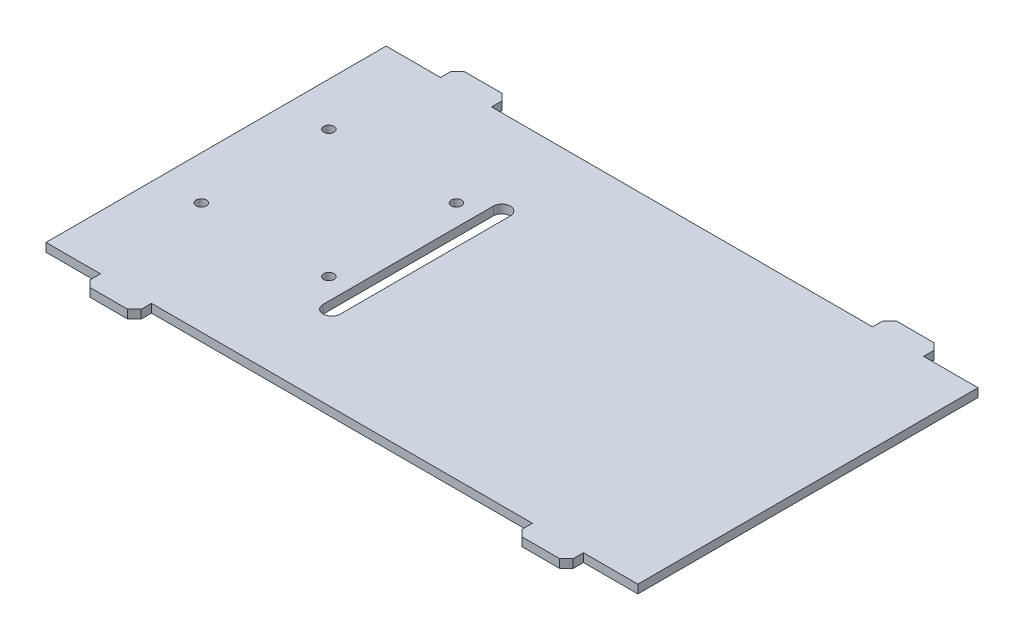
ISO-10303-21;
HEADER;
FILE_DESCRIPTION(('STEP AP214'),'2;1');
FILE_NAME('part.step','',(''),(''),'','','');
FILE_SCHEMA(('AUTOMOTIVE_DESIGN { 1 0 10303 214 1 1 1 1 }'));
ENDSEC;
DATA;
#1=APPLICATION_CONTEXT('core data for automotive mechanical design processes');
#2=APPLICATION_PROTOCOL_DEFINITION('international standard','automotive_design',2000,#1);
#3=PRODUCT_CONTEXT('',#1,'mechanical');
#4=PRODUCT('Part','Part','',(#3));
#5=PRODUCT_RELATED_PRODUCT_CATEGORY('part','',(#4));
#6=PRODUCT_DEFINITION_FORMATION('','',#4);
#7=PRODUCT_DEFINITION_CONTEXT('part definition',#1,'design');
#8=PRODUCT_DEFINITION('design','',#6,#7);
#9=PRODUCT_DEFINITION_SHAPE('','',#8);
#10=(LENGTH_UNIT() NAMED_UNIT(*) SI_UNIT(.MILLI.,.METRE.));
#11=(NAMED_UNIT(*) PLANE_ANGLE_UNIT() SI_UNIT($,.RADIAN.));
#12=(NAMED_UNIT(*) SI_UNIT($,.STERADIAN.) SOLID_ANGLE_UNIT());
#13=UNCERTAINTY_MEASURE_WITH_UNIT(LENGTH_MEASURE(1.E-05),#10,'distance_accuracy_value','');
#14=(GEOMETRIC_REPRESENTATION_CONTEXT(3) GLOBAL_UNCERTAINTY_ASSIGNED_CONTEXT((#13)) GLOBAL_UNIT_ASSIGNED_CONTEXT((#10,
#11,#12)) REPRESENTATION_CONTEXT('',''));
#15=CARTESIAN_POINT('',(0.,0.,0.));
#16=DIRECTION('',(0.,0.,1.));
#17=DIRECTION('',(1.,0.,0.));
#18=AXIS2_PLACEMENT_3D('',#15,#16,#17);
#19=CARTESIAN_POINT('',(-87.,2.5,-50.));
#20=DIRECTION('',(0.,0.,1.));
#21=DIRECTION('',(1.,0.,0.));
#22=AXIS2_PLACEMENT_3D('',#19,#20,#21);
#23=PLANE('',#22);
#24=DIRECTION('',(0.,1.,0.));
#25=VECTOR('',#24,1.);
#26=CARTESIAN_POINT('',(56.,0.,-50.));
#27=LINE('',#26,#25);
#28=CARTESIAN_POINT('',(56.,0.,-50.));
#29=VERTEX_POINT('',#28);
#30=CARTESIAN_POINT('',(56.,2.5,-50.));
#31=VERTEX_POINT('',#30);
#32=EDGE_CURVE('E260',#29,#31,#27,.T.);
#33=ORIENTED_EDGE('',*,*,#32,.F.);
#34=DIRECTION('',(-1.,0.,0.));
#35=VECTOR('',#34,1.);
#36=CARTESIAN_POINT('',(-87.,0.,-50.));
#37=LINE('',#36,#35);
#38=CARTESIAN_POINT('',(-56.,0.,-50.));
#39=VERTEX_POINT('',#38);
#40=EDGE_CURVE('E272',#29,#39,#37,.T.);
#41=ORIENTED_EDGE('',*,*,#40,.T.);
#42=DIRECTION('',(0.,1.,0.));
#43=VECTOR('',#42,1.);
#44=CARTESIAN_POINT('',(-56.,0.,-50.));
#45=LINE('',#44,#43);
#46=CARTESIAN_POINT('',(-56.,2.5,-50.));
#47=VERTEX_POINT('',#46);
#48=EDGE_CURVE('E385',#39,#47,#45,.T.);
#49=ORIENTED_EDGE('',*,*,#48,.T.);
#50=DIRECTION('',(-1.,0.,0.));
#51=VECTOR('',#50,1.);
#52=CARTESIAN_POINT('',(-87.,2.5,-50.));
#53=LINE('',#52,#51);
#54=EDGE_CURVE('E275',#31,#47,#53,.T.);
#55=ORIENTED_EDGE('',*,*,#54,.F.);
#56=EDGE_LOOP('',(#33,#41,#49,#55));
#57=FACE_BOUND('',#56,.T.);
#58=ADVANCED_FACE('F46',(#57),#23,.F.);
#59=DIRECTION('',(0.,1.,0.));
#60=VECTOR('',#59,1.);
#61=CARTESIAN_POINT('',(-71.,0.,-50.));
#62=LINE('',#61,#60);
#63=CARTESIAN_POINT('',(-71.,0.,-50.));
#64=VERTEX_POINT('',#63);
#65=CARTESIAN_POINT('',(-71.,2.5,-50.));
#66=VERTEX_POINT('',#65);
#67=EDGE_CURVE('E266',#64,#66,#62,.T.);
#68=ORIENTED_EDGE('',*,*,#67,.F.);
#69=CARTESIAN_POINT('',(-87.,0.,-50.));
#70=VERTEX_POINT('',#69);
#71=EDGE_CURVE('E284',#64,#70,#37,.T.);
#72=ORIENTED_EDGE('',*,*,#71,.T.);
#73=DIRECTION('',(0.,-1.,0.));
#74=VECTOR('',#73,1.);
#75=CARTESIAN_POINT('',(-87.,2.5,-50.));
#76=LINE('',#75,#74);
#77=CARTESIAN_POINT('',(-87.,2.5,-50.));
#78=VERTEX_POINT('',#77);
#79=EDGE_CURVE('E297',#78,#70,#76,.T.);
#80=ORIENTED_EDGE('',*,*,#79,.F.);
#81=EDGE_CURVE('E507',#66,#78,#53,.T.);
#82=ORIENTED_EDGE('',*,*,#81,.F.);
#83=EDGE_LOOP('',(#68,#72,#80,#82));
#84=FACE_BOUND('',#83,.T.);
#85=ADVANCED_FACE('F573',(#84),#23,.F.);
#86=CARTESIAN_POINT('',(87.,2.5,50.));
#87=DIRECTION('',(0.,0.,-1.));
#88=DIRECTION('',(-1.,0.,0.));
#89=AXIS2_PLACEMENT_3D('',#86,#87,#88);
#90=PLANE('',#89);
#91=DIRECTION('',(0.,1.,0.));
#92=VECTOR('',#91,1.);
#93=CARTESIAN_POINT('',(71.,0.,50.));
#94=LINE('',#93,#92);
#95=CARTESIAN_POINT('',(71.,0.,50.));
#96=VERTEX_POINT('',#95);
#97=CARTESIAN_POINT('',(71.,2.5,50.));
#98=VERTEX_POINT('',#97);
#99=EDGE_CURVE('E405',#96,#98,#94,.T.);
#100=ORIENTED_EDGE('',*,*,#99,.F.);
#101=DIRECTION('',(1.,0.,0.));
#102=VECTOR('',#101,1.);
#103=CARTESIAN_POINT('',(87.,0.,50.));
#104=LINE('',#103,#102);
#105=CARTESIAN_POINT('',(87.,0.,50.));
#106=VERTEX_POINT('',#105);
#107=EDGE_CURVE('E500',#96,#106,#104,.T.);
#108=ORIENTED_EDGE('',*,*,#107,.T.);
#109=DIRECTION('',(0.,-1.,0.));
#110=VECTOR('',#109,1.);
#111=CARTESIAN_POINT('',(87.,2.5,50.));
#112=LINE('',#111,#110);
#113=CARTESIAN_POINT('',(87.,2.5,50.));
#114=VERTEX_POINT('',#113);
#115=EDGE_CURVE('E304',#114,#106,#112,.T.);
#116=ORIENTED_EDGE('',*,*,#115,.F.);
#117=DIRECTION('',(1.,0.,0.));
#118=VECTOR('',#117,1.);
#119=CARTESIAN_POINT('',(87.,2.5,50.));
#120=LINE('',#119,#118);
#121=EDGE_CURVE('E293',#98,#114,#120,.T.);
#122=ORIENTED_EDGE('',*,*,#121,.F.);
#123=EDGE_LOOP('',(#100,#108,#116,#122));
#124=FACE_BOUND('',#123,.T.);
#125=ADVANCED_FACE('F523',(#124),#90,.F.);
#126=CARTESIAN_POINT('',(-56.,0.,50.));
#127=VERTEX_POINT('',#126);
#128=CARTESIAN_POINT('',(56.,0.,50.));
#129=VERTEX_POINT('',#128);
#130=EDGE_CURVE('E513',#127,#129,#104,.T.);
#131=ORIENTED_EDGE('',*,*,#130,.T.);
#132=DIRECTION('',(0.,1.,0.));
#133=VECTOR('',#132,1.);
#134=CARTESIAN_POINT('',(56.,0.,50.));
#135=LINE('',#134,#133);
#136=CARTESIAN_POINT('',(56.,2.5,50.));
#137=VERTEX_POINT('',#136);
#138=EDGE_CURVE('E410',#129,#137,#135,.T.);
#139=ORIENTED_EDGE('',*,*,#138,.T.);
#140=CARTESIAN_POINT('',(-56.,2.5,50.));
#141=VERTEX_POINT('',#140);
#142=EDGE_CURVE('E505',#141,#137,#120,.T.);
#143=ORIENTED_EDGE('',*,*,#142,.F.);
#144=DIRECTION('',(0.,1.,0.));
#145=VECTOR('',#144,1.);
#146=CARTESIAN_POINT('',(-56.,0.,50.));
#147=LINE('',#146,#145);
#148=EDGE_CURVE('E425',#127,#141,#147,.T.);
#149=ORIENTED_EDGE('',*,*,#148,.F.);
#150=EDGE_LOOP('',(#131,#139,#143,#149));
#151=FACE_BOUND('',#150,.T.);
#152=ADVANCED_FACE('F540',(#151),#90,.F.);
#153=CARTESIAN_POINT('',(0.,2.5,0.));
#154=DIRECTION('',(0.,-1.,0.));
#155=DIRECTION('',(0.,0.,-1.));
#156=AXIS2_PLACEMENT_3D('',#153,#154,#155);
#157=PLANE('',#156);
#158=DIRECTION('',(-1.,0.,0.));
#159=VECTOR('',#158,1.);
#160=CARTESIAN_POINT('',(0.,2.5,55.));
#161=LINE('',#160,#159);
#162=CARTESIAN_POINT('',(-58.,2.5,55.));
#163=VERTEX_POINT('',#162);
#164=CARTESIAN_POINT('',(-69.,2.5,55.));
#165=VERTEX_POINT('',#164);
#166=EDGE_CURVE('E429',#163,#165,#161,.T.);
#167=ORIENTED_EDGE('',*,*,#166,.F.);
#168=DIRECTION('',(0.707106781186548,0.,-0.707106781186548));
#169=VECTOR('',#168,1.);
#170=CARTESIAN_POINT('',(-58.,2.5,55.));
#171=LINE('',#170,#169);
#172=CARTESIAN_POINT('',(-56.,2.5,53.));
#173=VERTEX_POINT('',#172);
#174=EDGE_CURVE('E326',#163,#173,#171,.T.);
#175=ORIENTED_EDGE('',*,*,#174,.T.);
#176=DIRECTION('',(0.,0.,-1.));
#177=VECTOR('',#176,1.);
#178=CARTESIAN_POINT('',(-56.,2.5,55.));
#179=LINE('',#178,#177);
#180=EDGE_CURVE('E441',#173,#141,#179,.T.);
#181=ORIENTED_EDGE('',*,*,#180,.T.);
#182=ORIENTED_EDGE('',*,*,#142,.T.);
#183=DIRECTION('',(0.,0.,-1.));
#184=VECTOR('',#183,1.);
#185=CARTESIAN_POINT('',(56.,2.5,55.));
#186=LINE('',#185,#184);
#187=CARTESIAN_POINT('',(56.,2.5,53.));
#188=VERTEX_POINT('',#187);
#189=EDGE_CURVE('E419',#188,#137,#186,.T.);
#190=ORIENTED_EDGE('',*,*,#189,.F.);
#191=DIRECTION('',(-0.707106781186548,0.,-0.707106781186548));
#192=VECTOR('',#191,1.);
#193=CARTESIAN_POINT('',(56.,2.5,53.));
#194=LINE('',#193,#192);
#195=CARTESIAN_POINT('',(58.,2.5,55.));
#196=VERTEX_POINT('',#195);
#197=EDGE_CURVE('E322',#188,#196,#194,.F.);
#198=ORIENTED_EDGE('',*,*,#197,.T.);
#199=DIRECTION('',(-1.,0.,0.));
#200=VECTOR('',#199,1.);
#201=CARTESIAN_POINT('',(0.,2.5,55.));
#202=LINE('',#201,#200);
#203=CARTESIAN_POINT('',(69.,2.5,55.));
#204=VERTEX_POINT('',#203);
#205=EDGE_CURVE('E409',#204,#196,#202,.T.);
#206=ORIENTED_EDGE('',*,*,#205,.F.);
#207=DIRECTION('',(0.707106781186548,0.,-0.707106781186548));
#208=VECTOR('',#207,1.);
#209=CARTESIAN_POINT('',(69.,2.5,55.));
#210=LINE('',#209,#208);
#211=CARTESIAN_POINT('',(71.,2.5,53.));
#212=VERTEX_POINT('',#211);
#213=EDGE_CURVE('E320',#204,#212,#210,.T.);
#214=ORIENTED_EDGE('',*,*,#213,.T.);
#215=DIRECTION('',(0.,0.,-1.));
#216=VECTOR('',#215,1.);
#217=CARTESIAN_POINT('',(71.,2.5,55.));
#218=LINE('',#217,#216);
#219=EDGE_CURVE('E421',#212,#98,#218,.T.);
#220=ORIENTED_EDGE('',*,*,#219,.T.);
#221=ORIENTED_EDGE('',*,*,#121,.T.);
#222=DIRECTION('',(0.,0.,-1.));
#223=VECTOR('',#222,1.);
#224=CARTESIAN_POINT('',(87.,2.5,-50.));
#225=LINE('',#224,#223);
#226=CARTESIAN_POINT('',(87.,2.5,-50.));
#227=VERTEX_POINT('',#226);
#228=EDGE_CURVE('E504',#114,#227,#225,.T.);
#229=ORIENTED_EDGE('',*,*,#228,.T.);
#230=CARTESIAN_POINT('',(71.,2.5,-50.));
#231=VERTEX_POINT('',#230);
#232=EDGE_CURVE('E508',#227,#231,#53,.T.);
#233=ORIENTED_EDGE('',*,*,#232,.T.);
#234=DIRECTION('',(0.,0.,1.));
#235=VECTOR('',#234,1.);
#236=CARTESIAN_POINT('',(71.,2.5,-55.));
#237=LINE('',#236,#235);
#238=CARTESIAN_POINT('',(71.,2.5,-53.));
#239=VERTEX_POINT('',#238);
#240=EDGE_CURVE('E579',#239,#231,#237,.T.);
#241=ORIENTED_EDGE('',*,*,#240,.F.);
#242=DIRECTION('',(0.707106781186548,0.,0.707106781186548));
#243=VECTOR('',#242,1.);
#244=CARTESIAN_POINT('',(71.,2.5,-53.));
#245=LINE('',#244,#243);
#246=CARTESIAN_POINT('',(69.,2.5,-55.));
#247=VERTEX_POINT('',#246);
#248=EDGE_CURVE('E318',#239,#247,#245,.F.);
#249=ORIENTED_EDGE('',*,*,#248,.T.);
#250=DIRECTION('',(-1.,0.,0.));
#251=VECTOR('',#250,1.);
#252=CARTESIAN_POINT('',(0.,2.5,-55.));
#253=LINE('',#252,#251);
#254=CARTESIAN_POINT('',(58.,2.5,-55.));
#255=VERTEX_POINT('',#254);
#256=EDGE_CURVE('E583',#247,#255,#253,.T.);
#257=ORIENTED_EDGE('',*,*,#256,.T.);
#258=DIRECTION('',(-0.707106781186548,0.,0.707106781186548));
#259=VECTOR('',#258,1.);
#260=CARTESIAN_POINT('',(58.,2.5,-55.));
#261=LINE('',#260,#259);
#262=CARTESIAN_POINT('',(56.,2.5,-53.));
#263=VERTEX_POINT('',#262);
#264=EDGE_CURVE('E316',#255,#263,#261,.T.);
#265=ORIENTED_EDGE('',*,*,#264,.T.);
#266=DIRECTION('',(0.,0.,1.));
#267=VECTOR('',#266,1.);
#268=CARTESIAN_POINT('',(56.,2.5,-55.));
#269=LINE('',#268,#267);
#270=EDGE_CURVE('E267',#263,#31,#269,.T.);
#271=ORIENTED_EDGE('',*,*,#270,.T.);
#272=ORIENTED_EDGE('',*,*,#54,.T.);
#273=DIRECTION('',(0.,0.,1.));
#274=VECTOR('',#273,1.);
#275=CARTESIAN_POINT('',(-56.,2.5,-55.));
#276=LINE('',#275,#274);
#277=CARTESIAN_POINT('',(-56.,2.5,-53.));
#278=VERTEX_POINT('',#277);
#279=EDGE_CURVE('E392',#278,#47,#276,.T.);
#280=ORIENTED_EDGE('',*,*,#279,.F.);
#281=DIRECTION('',(0.707106781186548,0.,0.707106781186548));
#282=VECTOR('',#281,1.);
#283=CARTESIAN_POINT('',(-56.,2.5,-53.));
#284=LINE('',#283,#282);
#285=CARTESIAN_POINT('',(-58.,2.5,-55.));
#286=VERTEX_POINT('',#285);
#287=EDGE_CURVE('E314',#278,#286,#284,.F.);
#288=ORIENTED_EDGE('',*,*,#287,.T.);
#289=DIRECTION('',(-1.,0.,0.));
#290=VECTOR('',#289,1.);
#291=CARTESIAN_POINT('',(0.,2.5,-55.));
#292=LINE('',#291,#290);
#293=CARTESIAN_POINT('',(-69.,2.5,-55.));
#294=VERTEX_POINT('',#293);
#295=EDGE_CURVE('E380',#286,#294,#292,.T.);
#296=ORIENTED_EDGE('',*,*,#295,.T.);
#297=DIRECTION('',(-0.707106781186548,0.,0.707106781186548));
#298=VECTOR('',#297,1.);
#299=CARTESIAN_POINT('',(-69.,2.5,-55.));
#300=LINE('',#299,#298);
#301=CARTESIAN_POINT('',(-71.,2.5,-53.));
#302=VERTEX_POINT('',#301);
#303=EDGE_CURVE('E312',#294,#302,#300,.T.);
#304=ORIENTED_EDGE('',*,*,#303,.T.);
#305=DIRECTION('',(0.,0.,1.));
#306=VECTOR('',#305,1.);
#307=CARTESIAN_POINT('',(-71.,2.5,-55.));
#308=LINE('',#307,#306);
#309=EDGE_CURVE('E397',#302,#66,#308,.T.);
#310=ORIENTED_EDGE('',*,*,#309,.T.);
#311=ORIENTED_EDGE('',*,*,#81,.T.);
#312=DIRECTION('',(0.,0.,1.));
#313=VECTOR('',#312,1.);
#314=CARTESIAN_POINT('',(-87.,2.5,50.));
#315=LINE('',#314,#313);
#316=CARTESIAN_POINT('',(-87.,2.5,50.));
#317=VERTEX_POINT('',#316);
#318=EDGE_CURVE('E298',#78,#317,#315,.T.);
#319=ORIENTED_EDGE('',*,*,#318,.T.);
#320=CARTESIAN_POINT('',(-71.,2.5,50.));
#321=VERTEX_POINT('',#320);
#322=EDGE_CURVE('E501',#317,#321,#120,.T.);
#323=ORIENTED_EDGE('',*,*,#322,.T.);
#324=DIRECTION('',(0.,0.,-1.));
#325=VECTOR('',#324,1.);
#326=CARTESIAN_POINT('',(-71.,2.5,55.));
#327=LINE('',#326,#325);
#328=CARTESIAN_POINT('',(-71.,2.5,53.));
#329=VERTEX_POINT('',#328);
#330=EDGE_CURVE('E439',#329,#321,#327,.T.);
#331=ORIENTED_EDGE('',*,*,#330,.F.);
#332=DIRECTION('',(-0.707106781186548,0.,-0.707106781186548));
#333=VECTOR('',#332,1.);
#334=CARTESIAN_POINT('',(-71.,2.5,53.));
#335=LINE('',#334,#333);
#336=EDGE_CURVE('E324',#329,#165,#335,.F.);
#337=ORIENTED_EDGE('',*,*,#336,.T.);
#338=EDGE_LOOP('',(#167,#175,#181,#182,#190,#198,#206,#214,#220,#221,#229,#233,#241,#249,#257,
#265,#271,#272,#280,#288,#296,#304,#310,#311,#319,#323,#331,#337));
#339=FACE_BOUND('',#338,.T.);
#340=CARTESIAN_POINT('',(-28.,2.5,-25.));
#341=DIRECTION('',(0.,1.,0.));
#342=DIRECTION('',(0.,0.,1.));
#343=AXIS2_PLACEMENT_3D('',#340,#341,#342);
#344=CIRCLE('',#343,2.5);
#345=CARTESIAN_POINT('',(-25.5,2.5,-25.));
#346=VERTEX_POINT('',#345);
#347=CARTESIAN_POINT('',(-30.5,2.5,-25.));
#348=VERTEX_POINT('',#347);
#349=EDGE_CURVE('E470',#346,#348,#344,.T.);
#350=ORIENTED_EDGE('',*,*,#349,.F.);
#351=DIRECTION('',(0.,0.,-1.));
#352=VECTOR('',#351,1.);
#353=CARTESIAN_POINT('',(-25.5,2.5,-25.));
#354=LINE('',#353,#352);
#355=CARTESIAN_POINT('',(-25.5,2.5,25.));
#356=VERTEX_POINT('',#355);
#357=EDGE_CURVE('E478',#356,#346,#354,.T.);
#358=ORIENTED_EDGE('',*,*,#357,.F.);
#359=CARTESIAN_POINT('',(-28.,2.5,25.));
#360=DIRECTION('',(0.,1.,0.));
#361=DIRECTION('',(0.,0.,1.));
#362=AXIS2_PLACEMENT_3D('',#359,#360,#361);
#363=CIRCLE('',#362,2.5);
#364=CARTESIAN_POINT('',(-30.5,2.5,25.));
#365=VERTEX_POINT('',#364);
#366=EDGE_CURVE('E475',#365,#356,#363,.T.);
#367=ORIENTED_EDGE('',*,*,#366,.F.);
#368=DIRECTION('',(0.,0.,1.));
#369=VECTOR('',#368,1.);
#370=CARTESIAN_POINT('',(-30.5,2.5,-25.));
#371=LINE('',#370,#369);
#372=EDGE_CURVE('E472',#348,#365,#371,.T.);
#373=ORIENTED_EDGE('',*,*,#372,.F.);
#374=EDGE_LOOP('',(#350,#358,#367,#373));
#375=FACE_BOUND('',#374,.T.);
#376=CARTESIAN_POINT('',(-36.7329586200198,2.5,17.109359562993));
#377=DIRECTION('',(0.,1.,0.));
#378=DIRECTION('',(0.,0.,1.));
#379=AXIS2_PLACEMENT_3D('',#376,#377,#378);
#380=CIRCLE('',#379,1.5);
#381=CARTESIAN_POINT('',(-36.7329586200198,2.5,18.609359562993));
#382=VERTEX_POINT('',#381);
#383=EDGE_CURVE('E464',#382,#382,#380,.T.);
#384=ORIENTED_EDGE('',*,*,#383,.F.);
#385=EDGE_LOOP('',(#384));
#386=FACE_BOUND('',#385,.T.);
#387=CARTESIAN_POINT('',(-36.7329586200198,2.5,-20.390640437007));
#388=DIRECTION('',(0.,1.,0.));
#389=DIRECTION('',(0.,0.,1.));
#390=AXIS2_PLACEMENT_3D('',#387,#388,#389);
#391=CIRCLE('',#390,1.5);
#392=CARTESIAN_POINT('',(-36.7329586200198,2.5,-18.890640437007));
#393=VERTEX_POINT('',#392);
#394=EDGE_CURVE('E458',#393,#393,#391,.T.);
#395=ORIENTED_EDGE('',*,*,#394,.F.);
#396=EDGE_LOOP('',(#395));
#397=FACE_BOUND('',#396,.T.);
#398=CARTESIAN_POINT('',(-74.2329586200198,2.5,-20.390640437007));
#399=DIRECTION('',(0.,1.,0.));
#400=DIRECTION('',(0.,0.,1.));
#401=AXIS2_PLACEMENT_3D('',#398,#399,#400);
#402=CIRCLE('',#401,1.5);
#403=CARTESIAN_POINT('',(-74.2329586200198,2.5,-18.890640437007));
#404=VERTEX_POINT('',#403);
#405=EDGE_CURVE('E452',#404,#404,#402,.T.);
#406=ORIENTED_EDGE('',*,*,#405,.F.);
#407=EDGE_LOOP('',(#406));
#408=FACE_BOUND('',#407,.T.);
#409=CARTESIAN_POINT('',(-74.2329586200198,2.5,17.109359562993));
#410=DIRECTION('',(0.,1.,0.));
#411=DIRECTION('',(0.,0.,1.));
#412=AXIS2_PLACEMENT_3D('',#409,#410,#411);
#413=CIRCLE('',#412,1.5);
#414=CARTESIAN_POINT('',(-74.2329586200198,2.5,18.609359562993));
#415=VERTEX_POINT('',#414);
#416=EDGE_CURVE('E446',#415,#415,#413,.T.);
#417=ORIENTED_EDGE('',*,*,#416,.F.);
#418=EDGE_LOOP('',(#417));
#419=FACE_BOUND('',#418,.T.);
#420=ADVANCED_FACE('F395',(#339,#375,#386,#397,#408,#419),#157,.F.);
#421=CARTESIAN_POINT('',(0.,0.,0.));
#422=DIRECTION('',(0.,-1.,0.));
#423=DIRECTION('',(0.,0.,-1.));
#424=AXIS2_PLACEMENT_3D('',#421,#422,#423);
#425=PLANE('',#424);
#426=CARTESIAN_POINT('',(-74.2329586200198,0.,-20.390640437007));
#427=DIRECTION('',(0.,1.,0.));
#428=DIRECTION('',(0.,0.,1.));
#429=AXIS2_PLACEMENT_3D('',#426,#427,#428);
#430=CIRCLE('',#429,1.5);
#431=CARTESIAN_POINT('',(-74.2329586200198,0.,-18.890640437007));
#432=VERTEX_POINT('',#431);
#433=EDGE_CURVE('E449',#432,#432,#430,.T.);
#434=ORIENTED_EDGE('',*,*,#433,.T.);
#435=EDGE_LOOP('',(#434));
#436=FACE_BOUND('',#435,.T.);
#437=CARTESIAN_POINT('',(-36.7329586200198,0.,17.109359562993));
#438=DIRECTION('',(0.,1.,0.));
#439=DIRECTION('',(0.,0.,1.));
#440=AXIS2_PLACEMENT_3D('',#437,#438,#439);
#441=CIRCLE('',#440,1.5);
#442=CARTESIAN_POINT('',(-36.7329586200198,0.,18.609359562993));
#443=VERTEX_POINT('',#442);
#444=EDGE_CURVE('E461',#443,#443,#441,.T.);
#445=ORIENTED_EDGE('',*,*,#444,.T.);
#446=EDGE_LOOP('',(#445));
#447=FACE_BOUND('',#446,.T.);
#448=DIRECTION('',(0.,0.,-1.));
#449=VECTOR('',#448,1.);
#450=CARTESIAN_POINT('',(-56.,0.,55.));
#451=LINE('',#450,#449);
#452=CARTESIAN_POINT('',(-56.,0.,53.));
#453=VERTEX_POINT('',#452);
#454=EDGE_CURVE('E443',#453,#127,#451,.T.);
#455=ORIENTED_EDGE('',*,*,#454,.F.);
#456=DIRECTION('',(-0.707106781186548,0.,0.707106781186548));
#457=VECTOR('',#456,1.);
#458=CARTESIAN_POINT('',(-1.5,0.,-1.5));
#459=LINE('',#458,#457);
#460=CARTESIAN_POINT('',(-58.,0.,55.));
#461=VERTEX_POINT('',#460);
#462=EDGE_CURVE('E342',#453,#461,#459,.T.);
#463=ORIENTED_EDGE('',*,*,#462,.T.);
#464=DIRECTION('',(1.,0.,0.));
#465=VECTOR('',#464,1.);
#466=CARTESIAN_POINT('',(0.,0.,55.));
#467=LINE('',#466,#465);
#468=CARTESIAN_POINT('',(-69.,0.,55.));
#469=VERTEX_POINT('',#468);
#470=EDGE_CURVE('E426',#469,#461,#467,.T.);
#471=ORIENTED_EDGE('',*,*,#470,.F.);
#472=DIRECTION('',(0.707106781186548,0.,0.707106781186548));
#473=VECTOR('',#472,1.);
#474=CARTESIAN_POINT('',(-62.,0.,62.));
#475=LINE('',#474,#473);
#476=CARTESIAN_POINT('',(-71.,0.,53.));
#477=VERTEX_POINT('',#476);
#478=EDGE_CURVE('E62',#469,#477,#475,.F.);
#479=ORIENTED_EDGE('',*,*,#478,.T.);
#480=DIRECTION('',(0.,0.,-1.));
#481=VECTOR('',#480,1.);
#482=CARTESIAN_POINT('',(-71.,0.,55.));
#483=LINE('',#482,#481);
#484=CARTESIAN_POINT('',(-71.,0.,50.));
#485=VERTEX_POINT('',#484);
#486=EDGE_CURVE('E433',#477,#485,#483,.T.);
#487=ORIENTED_EDGE('',*,*,#486,.T.);
#488=CARTESIAN_POINT('',(-87.,0.,50.));
#489=VERTEX_POINT('',#488);
#490=EDGE_CURVE('E511',#489,#485,#104,.T.);
#491=ORIENTED_EDGE('',*,*,#490,.F.);
#492=DIRECTION('',(0.,0.,1.));
#493=VECTOR('',#492,1.);
#494=CARTESIAN_POINT('',(-87.,0.,50.));
#495=LINE('',#494,#493);
#496=EDGE_CURVE('E287',#70,#489,#495,.T.);
#497=ORIENTED_EDGE('',*,*,#496,.F.);
#498=ORIENTED_EDGE('',*,*,#71,.F.);
#499=DIRECTION('',(0.,0.,1.));
#500=VECTOR('',#499,1.);
#501=CARTESIAN_POINT('',(-71.,0.,-55.));
#502=LINE('',#501,#500);
#503=CARTESIAN_POINT('',(-71.,0.,-53.));
#504=VERTEX_POINT('',#503);
#505=EDGE_CURVE('E399',#504,#64,#502,.T.);
#506=ORIENTED_EDGE('',*,*,#505,.F.);
#507=DIRECTION('',(0.707106781186548,0.,-0.707106781186548));
#508=VECTOR('',#507,1.);
#509=CARTESIAN_POINT('',(-62.,0.,-62.));
#510=LINE('',#509,#508);
#511=CARTESIAN_POINT('',(-69.,0.,-55.));
#512=VERTEX_POINT('',#511);
#513=EDGE_CURVE('E330',#504,#512,#510,.T.);
#514=ORIENTED_EDGE('',*,*,#513,.T.);
#515=DIRECTION('',(1.,0.,0.));
#516=VECTOR('',#515,1.);
#517=CARTESIAN_POINT('',(0.,0.,-55.));
#518=LINE('',#517,#516);
#519=CARTESIAN_POINT('',(-58.,0.,-55.));
#520=VERTEX_POINT('',#519);
#521=EDGE_CURVE('E377',#512,#520,#518,.T.);
#522=ORIENTED_EDGE('',*,*,#521,.T.);
#523=DIRECTION('',(-0.707106781186548,0.,-0.707106781186548));
#524=VECTOR('',#523,1.);
#525=CARTESIAN_POINT('',(-1.49999999999999,0.,1.49999999999999));
#526=LINE('',#525,#524);
#527=CARTESIAN_POINT('',(-56.,0.,-53.));
#528=VERTEX_POINT('',#527);
#529=EDGE_CURVE('E332',#520,#528,#526,.F.);
#530=ORIENTED_EDGE('',*,*,#529,.T.);
#531=DIRECTION('',(0.,0.,1.));
#532=VECTOR('',#531,1.);
#533=CARTESIAN_POINT('',(-56.,0.,-55.));
#534=LINE('',#533,#532);
#535=EDGE_CURVE('E282',#528,#39,#534,.T.);
#536=ORIENTED_EDGE('',*,*,#535,.T.);
#537=ORIENTED_EDGE('',*,*,#40,.F.);
#538=DIRECTION('',(0.,0.,1.));
#539=VECTOR('',#538,1.);
#540=CARTESIAN_POINT('',(56.,0.,-55.));
#541=LINE('',#540,#539);
#542=CARTESIAN_POINT('',(56.,0.,-53.));
#543=VERTEX_POINT('',#542);
#544=EDGE_CURVE('E256',#543,#29,#541,.T.);
#545=ORIENTED_EDGE('',*,*,#544,.F.);
#546=DIRECTION('',(0.707106781186548,0.,-0.707106781186548));
#547=VECTOR('',#546,1.);
#548=CARTESIAN_POINT('',(1.5,0.,1.5));
#549=LINE('',#548,#547);
#550=CARTESIAN_POINT('',(58.,0.,-55.));
#551=VERTEX_POINT('',#550);
#552=EDGE_CURVE('E334',#543,#551,#549,.T.);
#553=ORIENTED_EDGE('',*,*,#552,.T.);
#554=DIRECTION('',(1.,0.,0.));
#555=VECTOR('',#554,1.);
#556=CARTESIAN_POINT('',(0.,0.,-55.));
#557=LINE('',#556,#555);
#558=CARTESIAN_POINT('',(69.,0.,-55.));
#559=VERTEX_POINT('',#558);
#560=EDGE_CURVE('E585',#551,#559,#557,.T.);
#561=ORIENTED_EDGE('',*,*,#560,.T.);
#562=DIRECTION('',(-0.707106781186548,0.,-0.707106781186548));
#563=VECTOR('',#562,1.);
#564=CARTESIAN_POINT('',(62.,0.,-62.));
#565=LINE('',#564,#563);
#566=CARTESIAN_POINT('',(71.,0.,-53.));
#567=VERTEX_POINT('',#566);
#568=EDGE_CURVE('E336',#559,#567,#565,.F.);
#569=ORIENTED_EDGE('',*,*,#568,.T.);
#570=DIRECTION('',(0.,0.,1.));
#571=VECTOR('',#570,1.);
#572=CARTESIAN_POINT('',(71.,0.,-55.));
#573=LINE('',#572,#571);
#574=CARTESIAN_POINT('',(71.,0.,-50.));
#575=VERTEX_POINT('',#574);
#576=EDGE_CURVE('E581',#567,#575,#573,.T.);
#577=ORIENTED_EDGE('',*,*,#576,.T.);
#578=CARTESIAN_POINT('',(87.,0.,-50.));
#579=VERTEX_POINT('',#578);
#580=EDGE_CURVE('E283',#579,#575,#37,.T.);
#581=ORIENTED_EDGE('',*,*,#580,.F.);
#582=DIRECTION('',(0.,0.,-1.));
#583=VECTOR('',#582,1.);
#584=CARTESIAN_POINT('',(87.,0.,-50.));
#585=LINE('',#584,#583);
#586=EDGE_CURVE('E288',#106,#579,#585,.T.);
#587=ORIENTED_EDGE('',*,*,#586,.F.);
#588=ORIENTED_EDGE('',*,*,#107,.F.);
#589=DIRECTION('',(0.,0.,-1.));
#590=VECTOR('',#589,1.);
#591=CARTESIAN_POINT('',(71.,0.,55.));
#592=LINE('',#591,#590);
#593=CARTESIAN_POINT('',(71.,0.,53.));
#594=VERTEX_POINT('',#593);
#595=EDGE_CURVE('E423',#594,#96,#592,.T.);
#596=ORIENTED_EDGE('',*,*,#595,.F.);
#597=DIRECTION('',(-0.707106781186548,0.,0.707106781186548));
#598=VECTOR('',#597,1.);
#599=CARTESIAN_POINT('',(62.,0.,62.));
#600=LINE('',#599,#598);
#601=CARTESIAN_POINT('',(69.,0.,55.));
#602=VERTEX_POINT('',#601);
#603=EDGE_CURVE('E338',#594,#602,#600,.T.);
#604=ORIENTED_EDGE('',*,*,#603,.T.);
#605=DIRECTION('',(1.,0.,0.));
#606=VECTOR('',#605,1.);
#607=CARTESIAN_POINT('',(0.,0.,55.));
#608=LINE('',#607,#606);
#609=CARTESIAN_POINT('',(58.,0.,55.));
#610=VERTEX_POINT('',#609);
#611=EDGE_CURVE('E406',#610,#602,#608,.T.);
#612=ORIENTED_EDGE('',*,*,#611,.F.);
#613=DIRECTION('',(0.707106781186548,0.,0.707106781186548));
#614=VECTOR('',#613,1.);
#615=CARTESIAN_POINT('',(1.49999999999999,0.,-1.49999999999999));
#616=LINE('',#615,#614);
#617=CARTESIAN_POINT('',(56.,0.,53.));
#618=VERTEX_POINT('',#617);
#619=EDGE_CURVE('E69',#610,#618,#616,.F.);
#620=ORIENTED_EDGE('',*,*,#619,.T.);
#621=DIRECTION('',(0.,0.,-1.));
#622=VECTOR('',#621,1.);
#623=CARTESIAN_POINT('',(56.,0.,55.));
#624=LINE('',#623,#622);
#625=EDGE_CURVE('E413',#618,#129,#624,.T.);
#626=ORIENTED_EDGE('',*,*,#625,.T.);
#627=ORIENTED_EDGE('',*,*,#130,.F.);
#628=EDGE_LOOP('',(#455,#463,#471,#479,#487,#491,#497,#498,#506,#514,#522,#530,#536,#537,#545,
#553,#561,#569,#577,#581,#587,#588,#596,#604,#612,#620,#626,#627));
#629=FACE_BOUND('',#628,.T.);
#630=DIRECTION('',(0.,0.,-1.));
#631=VECTOR('',#630,1.);
#632=CARTESIAN_POINT('',(-25.5,0.,-25.));
#633=LINE('',#632,#631);
#634=CARTESIAN_POINT('',(-25.5,0.,25.));
#635=VERTEX_POINT('',#634);
#636=CARTESIAN_POINT('',(-25.5,0.,-25.));
#637=VERTEX_POINT('',#636);
#638=EDGE_CURVE('E473',#635,#637,#633,.T.);
#639=ORIENTED_EDGE('',*,*,#638,.T.);
#640=CARTESIAN_POINT('',(-28.,0.,-25.));
#641=DIRECTION('',(0.,1.,0.));
#642=DIRECTION('',(0.,0.,1.));
#643=AXIS2_PLACEMENT_3D('',#640,#641,#642);
#644=CIRCLE('',#643,2.5);
#645=CARTESIAN_POINT('',(-30.5,0.,-25.));
#646=VERTEX_POINT('',#645);
#647=EDGE_CURVE('E467',#637,#646,#644,.T.);
#648=ORIENTED_EDGE('',*,*,#647,.T.);
#649=DIRECTION('',(0.,0.,1.));
#650=VECTOR('',#649,1.);
#651=CARTESIAN_POINT('',(-30.5,0.,-25.));
#652=LINE('',#651,#650);
#653=CARTESIAN_POINT('',(-30.5,0.,25.));
#654=VERTEX_POINT('',#653);
#655=EDGE_CURVE('E483',#646,#654,#652,.T.);
#656=ORIENTED_EDGE('',*,*,#655,.T.);
#657=CARTESIAN_POINT('',(-28.,0.,25.));
#658=DIRECTION('',(0.,1.,0.));
#659=DIRECTION('',(0.,0.,1.));
#660=AXIS2_PLACEMENT_3D('',#657,#658,#659);
#661=CIRCLE('',#660,2.5);
#662=EDGE_CURVE('E486',#654,#635,#661,.T.);
#663=ORIENTED_EDGE('',*,*,#662,.T.);
#664=EDGE_LOOP('',(#639,#648,#656,#663));
#665=FACE_BOUND('',#664,.T.);
#666=CARTESIAN_POINT('',(-36.7329586200198,0.,-20.390640437007));
#667=DIRECTION('',(0.,1.,0.));
#668=DIRECTION('',(0.,0.,1.));
#669=AXIS2_PLACEMENT_3D('',#666,#667,#668);
#670=CIRCLE('',#669,1.5);
#671=CARTESIAN_POINT('',(-36.7329586200198,0.,-18.890640437007));
#672=VERTEX_POINT('',#671);
#673=EDGE_CURVE('E455',#672,#672,#670,.T.);
#674=ORIENTED_EDGE('',*,*,#673,.T.);
#675=EDGE_LOOP('',(#674));
#676=FACE_BOUND('',#675,.T.);
#677=CARTESIAN_POINT('',(-74.2329586200198,0.,17.109359562993));
#678=DIRECTION('',(0.,1.,0.));
#679=DIRECTION('',(0.,0.,1.));
#680=AXIS2_PLACEMENT_3D('',#677,#678,#679);
#681=CIRCLE('',#680,1.5);
#682=CARTESIAN_POINT('',(-74.2329586200198,0.,18.609359562993));
#683=VERTEX_POINT('',#682);
#684=EDGE_CURVE('E445',#683,#683,#681,.T.);
#685=ORIENTED_EDGE('',*,*,#684,.T.);
#686=EDGE_LOOP('',(#685));
#687=FACE_BOUND('',#686,.T.);
#688=ADVANCED_FACE('F279',(#436,#447,#629,#665,#676,#687),#425,.T.);
#689=ORIENTED_EDGE('',*,*,#490,.T.);
#690=DIRECTION('',(0.,1.,0.));
#691=VECTOR('',#690,1.);
#692=CARTESIAN_POINT('',(-71.,0.,50.));
#693=LINE('',#692,#691);
#694=EDGE_CURVE('E430',#485,#321,#693,.T.);
#695=ORIENTED_EDGE('',*,*,#694,.T.);
#696=ORIENTED_EDGE('',*,*,#322,.F.);
#697=DIRECTION('',(0.,-1.,0.));
#698=VECTOR('',#697,1.);
#699=CARTESIAN_POINT('',(-87.,2.5,50.));
#700=LINE('',#699,#698);
#701=EDGE_CURVE('E294',#317,#489,#700,.T.);
#702=ORIENTED_EDGE('',*,*,#701,.T.);
#703=EDGE_LOOP('',(#689,#695,#696,#702));
#704=FACE_BOUND('',#703,.T.);
#705=ADVANCED_FACE('F567',(#704),#90,.F.);
#706=CARTESIAN_POINT('',(87.,2.5,-50.));
#707=DIRECTION('',(-1.,0.,0.));
#708=DIRECTION('',(0.,0.,1.));
#709=AXIS2_PLACEMENT_3D('',#706,#707,#708);
#710=PLANE('',#709);
#711=ORIENTED_EDGE('',*,*,#586,.T.);
#712=DIRECTION('',(0.,-1.,0.));
#713=VECTOR('',#712,1.);
#714=CARTESIAN_POINT('',(87.,2.5,-50.));
#715=LINE('',#714,#713);
#716=EDGE_CURVE('E301',#227,#579,#715,.T.);
#717=ORIENTED_EDGE('',*,*,#716,.F.);
#718=ORIENTED_EDGE('',*,*,#228,.F.);
#719=ORIENTED_EDGE('',*,*,#115,.T.);
#720=EDGE_LOOP('',(#711,#717,#718,#719));
#721=FACE_BOUND('',#720,.T.);
#722=ADVANCED_FACE('F530',(#721),#710,.F.);
#723=ORIENTED_EDGE('',*,*,#580,.T.);
#724=DIRECTION('',(0.,1.,0.));
#725=VECTOR('',#724,1.);
#726=CARTESIAN_POINT('',(71.,0.,-50.));
#727=LINE('',#726,#725);
#728=EDGE_CURVE('E276',#575,#231,#727,.T.);
#729=ORIENTED_EDGE('',*,*,#728,.T.);
#730=ORIENTED_EDGE('',*,*,#232,.F.);
#731=ORIENTED_EDGE('',*,*,#716,.T.);
#732=EDGE_LOOP('',(#723,#729,#730,#731));
#733=FACE_BOUND('',#732,.T.);
#734=ADVANCED_FACE('F617',(#733),#23,.F.);
#735=CARTESIAN_POINT('',(-87.,2.5,50.));
#736=DIRECTION('',(1.,0.,0.));
#737=DIRECTION('',(0.,0.,-1.));
#738=AXIS2_PLACEMENT_3D('',#735,#736,#737);
#739=PLANE('',#738);
#740=ORIENTED_EDGE('',*,*,#496,.T.);
#741=ORIENTED_EDGE('',*,*,#701,.F.);
#742=ORIENTED_EDGE('',*,*,#318,.F.);
#743=ORIENTED_EDGE('',*,*,#79,.T.);
#744=EDGE_LOOP('',(#740,#741,#742,#743));
#745=FACE_BOUND('',#744,.T.);
#746=ADVANCED_FACE('F563',(#745),#739,.F.);
#747=CARTESIAN_POINT('',(-28.,2.5,-25.));
#748=DIRECTION('',(0.,-1.,0.));
#749=DIRECTION('',(0.,0.,-1.));
#750=AXIS2_PLACEMENT_3D('',#747,#748,#749);
#751=CYLINDRICAL_SURFACE('',#750,2.5);
#752=ORIENTED_EDGE('',*,*,#647,.F.);
#753=DIRECTION('',(0.,-1.,0.));
#754=VECTOR('',#753,1.);
#755=CARTESIAN_POINT('',(-25.5,2.5,-25.));
#756=LINE('',#755,#754);
#757=EDGE_CURVE('E480',#346,#637,#756,.T.);
#758=ORIENTED_EDGE('',*,*,#757,.F.);
#759=ORIENTED_EDGE('',*,*,#349,.T.);
#760=DIRECTION('',(0.,-1.,0.));
#761=VECTOR('',#760,1.);
#762=CARTESIAN_POINT('',(-30.5,2.5,-25.));
#763=LINE('',#762,#761);
#764=EDGE_CURVE('E497',#348,#646,#763,.T.);
#765=ORIENTED_EDGE('',*,*,#764,.T.);
#766=EDGE_LOOP('',(#752,#758,#759,#765));
#767=FACE_BOUND('',#766,.T.);
#768=ADVANCED_FACE('F629',(#767),#751,.F.);
#769=CARTESIAN_POINT('',(-30.5,2.5,-25.));
#770=DIRECTION('',(1.,0.,0.));
#771=DIRECTION('',(0.,0.,-1.));
#772=AXIS2_PLACEMENT_3D('',#769,#770,#771);
#773=PLANE('',#772);
#774=ORIENTED_EDGE('',*,*,#655,.F.);
#775=ORIENTED_EDGE('',*,*,#764,.F.);
#776=ORIENTED_EDGE('',*,*,#372,.T.);
#777=DIRECTION('',(0.,-1.,0.));
#778=VECTOR('',#777,1.);
#779=CARTESIAN_POINT('',(-30.5,2.5,25.));
#780=LINE('',#779,#778);
#781=EDGE_CURVE('E495',#365,#654,#780,.T.);
#782=ORIENTED_EDGE('',*,*,#781,.T.);
#783=EDGE_LOOP('',(#774,#775,#776,#782));
#784=FACE_BOUND('',#783,.T.);
#785=ADVANCED_FACE('F721',(#784),#773,.T.);
#786=CARTESIAN_POINT('',(-28.,2.5,25.));
#787=DIRECTION('',(0.,-1.,0.));
#788=DIRECTION('',(0.,0.,-1.));
#789=AXIS2_PLACEMENT_3D('',#786,#787,#788);
#790=CYLINDRICAL_SURFACE('',#789,2.5);
#791=ORIENTED_EDGE('',*,*,#662,.F.);
#792=ORIENTED_EDGE('',*,*,#781,.F.);
#793=ORIENTED_EDGE('',*,*,#366,.T.);
#794=DIRECTION('',(0.,-1.,0.));
#795=VECTOR('',#794,1.);
#796=CARTESIAN_POINT('',(-25.5,2.5,25.));
#797=LINE('',#796,#795);
#798=EDGE_CURVE('E493',#356,#635,#797,.T.);
#799=ORIENTED_EDGE('',*,*,#798,.T.);
#800=EDGE_LOOP('',(#791,#792,#793,#799));
#801=FACE_BOUND('',#800,.T.);
#802=ADVANCED_FACE('F717',(#801),#790,.F.);
#803=CARTESIAN_POINT('',(-25.5,2.5,-25.));
#804=DIRECTION('',(-1.,0.,0.));
#805=DIRECTION('',(0.,0.,1.));
#806=AXIS2_PLACEMENT_3D('',#803,#804,#805);
#807=PLANE('',#806);
#808=ORIENTED_EDGE('',*,*,#638,.F.);
#809=ORIENTED_EDGE('',*,*,#798,.F.);
#810=ORIENTED_EDGE('',*,*,#357,.T.);
#811=ORIENTED_EDGE('',*,*,#757,.T.);
#812=EDGE_LOOP('',(#808,#809,#810,#811));
#813=FACE_BOUND('',#812,.T.);
#814=ADVANCED_FACE('F713',(#813),#807,.T.);
#815=CARTESIAN_POINT('',(-36.7329586200198,2.5,17.109359562993));
#816=DIRECTION('',(0.,-1.,0.));
#817=DIRECTION('',(0.,0.,-1.));
#818=AXIS2_PLACEMENT_3D('',#815,#816,#817);
#819=CYLINDRICAL_SURFACE('',#818,1.5);
#820=ORIENTED_EDGE('',*,*,#444,.F.);
#821=EDGE_LOOP('',(#820));
#822=FACE_BOUND('',#821,.T.);
#823=ORIENTED_EDGE('',*,*,#383,.T.);
#824=EDGE_LOOP('',(#823));
#825=FACE_BOUND('',#824,.T.);
#826=ADVANCED_FACE('F709',(#822,#825),#819,.F.);
#827=CARTESIAN_POINT('',(-36.7329586200198,2.5,-20.390640437007));
#828=DIRECTION('',(0.,-1.,0.));
#829=DIRECTION('',(0.,0.,-1.));
#830=AXIS2_PLACEMENT_3D('',#827,#828,#829);
#831=CYLINDRICAL_SURFACE('',#830,1.5);
#832=ORIENTED_EDGE('',*,*,#673,.F.);
#833=EDGE_LOOP('',(#832));
#834=FACE_BOUND('',#833,.T.);
#835=ORIENTED_EDGE('',*,*,#394,.T.);
#836=EDGE_LOOP('',(#835));
#837=FACE_BOUND('',#836,.T.);
#838=ADVANCED_FACE('F705',(#834,#837),#831,.F.);
#839=CARTESIAN_POINT('',(-74.2329586200198,2.5,-20.390640437007));
#840=DIRECTION('',(0.,-1.,0.));
#841=DIRECTION('',(0.,0.,-1.));
#842=AXIS2_PLACEMENT_3D('',#839,#840,#841);
#843=CYLINDRICAL_SURFACE('',#842,1.5);
#844=ORIENTED_EDGE('',*,*,#433,.F.);
#845=EDGE_LOOP('',(#844));
#846=FACE_BOUND('',#845,.T.);
#847=ORIENTED_EDGE('',*,*,#405,.T.);
#848=EDGE_LOOP('',(#847));
#849=FACE_BOUND('',#848,.T.);
#850=ADVANCED_FACE('F701',(#846,#849),#843,.F.);
#851=CARTESIAN_POINT('',(-74.2329586200198,2.5,17.109359562993));
#852=DIRECTION('',(0.,-1.,0.));
#853=DIRECTION('',(0.,0.,-1.));
#854=AXIS2_PLACEMENT_3D('',#851,#852,#853);
#855=CYLINDRICAL_SURFACE('',#854,1.5);
#856=ORIENTED_EDGE('',*,*,#684,.F.);
#857=EDGE_LOOP('',(#856));
#858=FACE_BOUND('',#857,.T.);
#859=ORIENTED_EDGE('',*,*,#416,.T.);
#860=EDGE_LOOP('',(#859));
#861=FACE_BOUND('',#860,.T.);
#862=ADVANCED_FACE('F698',(#858,#861),#855,.F.);
#863=CARTESIAN_POINT('',(-56.,0.,55.));
#864=DIRECTION('',(-1.,0.,0.));
#865=DIRECTION('',(0.,0.,1.));
#866=AXIS2_PLACEMENT_3D('',#863,#864,#865);
#867=PLANE('',#866);
#868=ORIENTED_EDGE('',*,*,#180,.F.);
#869=DIRECTION('',(0.,-1.,0.));
#870=VECTOR('',#869,1.);
#871=CARTESIAN_POINT('',(-56.,0.,53.));
#872=LINE('',#871,#870);
#873=EDGE_CURVE('E328',#173,#453,#872,.T.);
#874=ORIENTED_EDGE('',*,*,#873,.T.);
#875=ORIENTED_EDGE('',*,*,#454,.T.);
#876=ORIENTED_EDGE('',*,*,#148,.T.);
#877=EDGE_LOOP('',(#868,#874,#875,#876));
#878=FACE_BOUND('',#877,.T.);
#879=ADVANCED_FACE('F544',(#878),#867,.F.);
#880=CARTESIAN_POINT('',(-71.,0.,55.));
#881=DIRECTION('',(-1.,0.,0.));
#882=DIRECTION('',(0.,0.,1.));
#883=AXIS2_PLACEMENT_3D('',#880,#881,#882);
#884=PLANE('',#883);
#885=ORIENTED_EDGE('',*,*,#486,.F.);
#886=DIRECTION('',(0.,1.,0.));
#887=VECTOR('',#886,1.);
#888=CARTESIAN_POINT('',(-71.,0.,53.));
#889=LINE('',#888,#887);
#890=EDGE_CURVE('E344',#477,#329,#889,.T.);
#891=ORIENTED_EDGE('',*,*,#890,.T.);
#892=ORIENTED_EDGE('',*,*,#330,.T.);
#893=ORIENTED_EDGE('',*,*,#694,.F.);
#894=EDGE_LOOP('',(#885,#891,#892,#893));
#895=FACE_BOUND('',#894,.T.);
#896=ADVANCED_FACE('F558',(#895),#884,.T.);
#897=CARTESIAN_POINT('',(0.,0.,55.));
#898=DIRECTION('',(0.,0.,1.));
#899=DIRECTION('',(1.,0.,0.));
#900=AXIS2_PLACEMENT_3D('',#897,#898,#899);
#901=PLANE('',#900);
#902=ORIENTED_EDGE('',*,*,#470,.T.);
#903=DIRECTION('',(0.,1.,0.));
#904=VECTOR('',#903,1.);
#905=CARTESIAN_POINT('',(-58.,2.5,55.));
#906=LINE('',#905,#904);
#907=EDGE_CURVE('E309',#461,#163,#906,.T.);
#908=ORIENTED_EDGE('',*,*,#907,.T.);
#909=ORIENTED_EDGE('',*,*,#166,.T.);
#910=DIRECTION('',(0.,-1.,0.));
#911=VECTOR('',#910,1.);
#912=CARTESIAN_POINT('',(-69.,0.,55.));
#913=LINE('',#912,#911);
#914=EDGE_CURVE('E307',#165,#469,#913,.T.);
#915=ORIENTED_EDGE('',*,*,#914,.T.);
#916=EDGE_LOOP('',(#902,#908,#909,#915));
#917=FACE_BOUND('',#916,.T.);
#918=ADVANCED_FACE('F551',(#917),#901,.T.);
#919=CARTESIAN_POINT('',(71.,0.,55.));
#920=DIRECTION('',(-1.,0.,0.));
#921=DIRECTION('',(0.,0.,1.));
#922=AXIS2_PLACEMENT_3D('',#919,#920,#921);
#923=PLANE('',#922);
#924=ORIENTED_EDGE('',*,*,#219,.F.);
#925=DIRECTION('',(0.,-1.,0.));
#926=VECTOR('',#925,1.);
#927=CARTESIAN_POINT('',(71.,0.,53.));
#928=LINE('',#927,#926);
#929=EDGE_CURVE('E355',#212,#594,#928,.T.);
#930=ORIENTED_EDGE('',*,*,#929,.T.);
#931=ORIENTED_EDGE('',*,*,#595,.T.);
#932=ORIENTED_EDGE('',*,*,#99,.T.);
#933=EDGE_LOOP('',(#924,#930,#931,#932));
#934=FACE_BOUND('',#933,.T.);
#935=ADVANCED_FACE('F680',(#934),#923,.F.);
#936=CARTESIAN_POINT('',(56.,0.,55.));
#937=DIRECTION('',(-1.,0.,0.));
#938=DIRECTION('',(0.,0.,1.));
#939=AXIS2_PLACEMENT_3D('',#936,#937,#938);
#940=PLANE('',#939);
#941=ORIENTED_EDGE('',*,*,#625,.F.);
#942=DIRECTION('',(0.,1.,0.));
#943=VECTOR('',#942,1.);
#944=CARTESIAN_POINT('',(56.,0.,53.));
#945=LINE('',#944,#943);
#946=EDGE_CURVE('E347',#618,#188,#945,.T.);
#947=ORIENTED_EDGE('',*,*,#946,.T.);
#948=ORIENTED_EDGE('',*,*,#189,.T.);
#949=ORIENTED_EDGE('',*,*,#138,.F.);
#950=EDGE_LOOP('',(#941,#947,#948,#949));
#951=FACE_BOUND('',#950,.T.);
#952=ADVANCED_FACE('F678',(#951),#940,.T.);
#953=CARTESIAN_POINT('',(0.,0.,55.));
#954=DIRECTION('',(0.,0.,1.));
#955=DIRECTION('',(1.,0.,0.));
#956=AXIS2_PLACEMENT_3D('',#953,#954,#955);
#957=PLANE('',#956);
#958=ORIENTED_EDGE('',*,*,#205,.T.);
#959=DIRECTION('',(0.,-1.,0.));
#960=VECTOR('',#959,1.);
#961=CARTESIAN_POINT('',(58.,0.,55.));
#962=LINE('',#961,#960);
#963=EDGE_CURVE('E353',#196,#610,#962,.T.);
#964=ORIENTED_EDGE('',*,*,#963,.T.);
#965=ORIENTED_EDGE('',*,*,#611,.T.);
#966=DIRECTION('',(0.,1.,0.));
#967=VECTOR('',#966,1.);
#968=CARTESIAN_POINT('',(69.,2.5,55.));
#969=LINE('',#968,#967);
#970=EDGE_CURVE('E350',#602,#204,#969,.T.);
#971=ORIENTED_EDGE('',*,*,#970,.T.);
#972=EDGE_LOOP('',(#958,#964,#965,#971));
#973=FACE_BOUND('',#972,.T.);
#974=ADVANCED_FACE('F673',(#973),#957,.T.);
#975=CARTESIAN_POINT('',(-71.,0.,-55.));
#976=DIRECTION('',(1.,0.,0.));
#977=DIRECTION('',(0.,0.,-1.));
#978=AXIS2_PLACEMENT_3D('',#975,#976,#977);
#979=PLANE('',#978);
#980=ORIENTED_EDGE('',*,*,#309,.F.);
#981=DIRECTION('',(0.,-1.,0.));
#982=VECTOR('',#981,1.);
#983=CARTESIAN_POINT('',(-71.,0.,-53.));
#984=LINE('',#983,#982);
#985=EDGE_CURVE('E11',#302,#504,#984,.T.);
#986=ORIENTED_EDGE('',*,*,#985,.T.);
#987=ORIENTED_EDGE('',*,*,#505,.T.);
#988=ORIENTED_EDGE('',*,*,#67,.T.);
#989=EDGE_LOOP('',(#980,#986,#987,#988));
#990=FACE_BOUND('',#989,.T.);
#991=ADVANCED_FACE('F686',(#990),#979,.F.);
#992=CARTESIAN_POINT('',(-56.,0.,-55.));
#993=DIRECTION('',(1.,0.,0.));
#994=DIRECTION('',(0.,0.,-1.));
#995=AXIS2_PLACEMENT_3D('',#992,#993,#994);
#996=PLANE('',#995);
#997=ORIENTED_EDGE('',*,*,#535,.F.);
#998=DIRECTION('',(0.,1.,0.));
#999=VECTOR('',#998,1.);
#1000=CARTESIAN_POINT('',(-56.,0.,-53.));
#1001=LINE('',#1000,#999);
#1002=EDGE_CURVE('E366',#528,#278,#1001,.T.);
#1003=ORIENTED_EDGE('',*,*,#1002,.T.);
#1004=ORIENTED_EDGE('',*,*,#279,.T.);
#1005=ORIENTED_EDGE('',*,*,#48,.F.);
#1006=EDGE_LOOP('',(#997,#1003,#1004,#1005));
#1007=FACE_BOUND('',#1006,.T.);
#1008=ADVANCED_FACE('F391',(#1007),#996,.T.);
#1009=CARTESIAN_POINT('',(0.,0.,-55.));
#1010=DIRECTION('',(0.,0.,-1.));
#1011=DIRECTION('',(1.,0.,0.));
#1012=AXIS2_PLACEMENT_3D('',#1009,#1010,#1011);
#1013=PLANE('',#1012);
#1014=ORIENTED_EDGE('',*,*,#295,.F.);
#1015=DIRECTION('',(0.,-1.,0.));
#1016=VECTOR('',#1015,1.);
#1017=CARTESIAN_POINT('',(-58.,0.,-55.));
#1018=LINE('',#1017,#1016);
#1019=EDGE_CURVE('E55',#286,#520,#1018,.T.);
#1020=ORIENTED_EDGE('',*,*,#1019,.T.);
#1021=ORIENTED_EDGE('',*,*,#521,.F.);
#1022=DIRECTION('',(0.,1.,0.));
#1023=VECTOR('',#1022,1.);
#1024=CARTESIAN_POINT('',(-69.,2.5,-55.));
#1025=LINE('',#1024,#1023);
#1026=EDGE_CURVE('E369',#512,#294,#1025,.T.);
#1027=ORIENTED_EDGE('',*,*,#1026,.T.);
#1028=EDGE_LOOP('',(#1014,#1020,#1021,#1027));
#1029=FACE_BOUND('',#1028,.T.);
#1030=ADVANCED_FACE('F376',(#1029),#1013,.T.);
#1031=CARTESIAN_POINT('',(56.,0.,-55.));
#1032=DIRECTION('',(1.,0.,0.));
#1033=DIRECTION('',(0.,0.,-1.));
#1034=AXIS2_PLACEMENT_3D('',#1031,#1032,#1033);
#1035=PLANE('',#1034);
#1036=ORIENTED_EDGE('',*,*,#270,.F.);
#1037=DIRECTION('',(0.,-1.,0.));
#1038=VECTOR('',#1037,1.);
#1039=CARTESIAN_POINT('',(56.,0.,-53.));
#1040=LINE('',#1039,#1038);
#1041=EDGE_CURVE('E263',#263,#543,#1040,.T.);
#1042=ORIENTED_EDGE('',*,*,#1041,.T.);
#1043=ORIENTED_EDGE('',*,*,#544,.T.);
#1044=ORIENTED_EDGE('',*,*,#32,.T.);
#1045=EDGE_LOOP('',(#1036,#1042,#1043,#1044));
#1046=FACE_BOUND('',#1045,.T.);
#1047=ADVANCED_FACE('F259',(#1046),#1035,.F.);
#1048=CARTESIAN_POINT('',(71.,0.,-55.));
#1049=DIRECTION('',(1.,0.,0.));
#1050=DIRECTION('',(0.,0.,-1.));
#1051=AXIS2_PLACEMENT_3D('',#1048,#1049,#1050);
#1052=PLANE('',#1051);
#1053=ORIENTED_EDGE('',*,*,#576,.F.);
#1054=DIRECTION('',(0.,1.,0.));
#1055=VECTOR('',#1054,1.);
#1056=CARTESIAN_POINT('',(71.,0.,-53.));
#1057=LINE('',#1056,#1055);
#1058=EDGE_CURVE('E357',#567,#239,#1057,.T.);
#1059=ORIENTED_EDGE('',*,*,#1058,.T.);
#1060=ORIENTED_EDGE('',*,*,#240,.T.);
#1061=ORIENTED_EDGE('',*,*,#728,.F.);
#1062=EDGE_LOOP('',(#1053,#1059,#1060,#1061));
#1063=FACE_BOUND('',#1062,.T.);
#1064=ADVANCED_FACE('F600',(#1063),#1052,.T.);
#1065=CARTESIAN_POINT('',(0.,0.,-55.));
#1066=DIRECTION('',(0.,0.,-1.));
#1067=DIRECTION('',(1.,0.,0.));
#1068=AXIS2_PLACEMENT_3D('',#1065,#1066,#1067);
#1069=PLANE('',#1068);
#1070=ORIENTED_EDGE('',*,*,#256,.F.);
#1071=DIRECTION('',(0.,-1.,0.));
#1072=VECTOR('',#1071,1.);
#1073=CARTESIAN_POINT('',(69.,0.,-55.));
#1074=LINE('',#1073,#1072);
#1075=EDGE_CURVE('E363',#247,#559,#1074,.T.);
#1076=ORIENTED_EDGE('',*,*,#1075,.T.);
#1077=ORIENTED_EDGE('',*,*,#560,.F.);
#1078=DIRECTION('',(0.,1.,0.));
#1079=VECTOR('',#1078,1.);
#1080=CARTESIAN_POINT('',(58.,2.5,-55.));
#1081=LINE('',#1080,#1079);
#1082=EDGE_CURVE('E360',#551,#255,#1081,.T.);
#1083=ORIENTED_EDGE('',*,*,#1082,.T.);
#1084=EDGE_LOOP('',(#1070,#1076,#1077,#1083));
#1085=FACE_BOUND('',#1084,.T.);
#1086=ADVANCED_FACE('F603',(#1085),#1069,.T.);
#1087=CARTESIAN_POINT('',(-58.,0.,55.));
#1088=DIRECTION('',(0.707106781186547,0.,0.707106781186547));
#1089=DIRECTION('',(0.,-1.,0.));
#1090=AXIS2_PLACEMENT_3D('',#1087,#1088,#1089);
#1091=PLANE('',#1090);
#1092=ORIENTED_EDGE('',*,*,#462,.F.);
#1093=ORIENTED_EDGE('',*,*,#873,.F.);
#1094=ORIENTED_EDGE('',*,*,#174,.F.);
#1095=ORIENTED_EDGE('',*,*,#907,.F.);
#1096=EDGE_LOOP('',(#1092,#1093,#1094,#1095));
#1097=FACE_BOUND('',#1096,.T.);
#1098=ADVANCED_FACE('F549',(#1097),#1091,.T.);
#1099=CARTESIAN_POINT('',(-71.,0.,53.));
#1100=DIRECTION('',(0.707106781186547,0.,-0.707106781186547));
#1101=DIRECTION('',(0.,1.,0.));
#1102=AXIS2_PLACEMENT_3D('',#1099,#1100,#1101);
#1103=PLANE('',#1102);
#1104=ORIENTED_EDGE('',*,*,#478,.F.);
#1105=ORIENTED_EDGE('',*,*,#914,.F.);
#1106=ORIENTED_EDGE('',*,*,#336,.F.);
#1107=ORIENTED_EDGE('',*,*,#890,.F.);
#1108=EDGE_LOOP('',(#1104,#1105,#1106,#1107));
#1109=FACE_BOUND('',#1108,.T.);
#1110=ADVANCED_FACE('F556',(#1109),#1103,.F.);
#1111=CARTESIAN_POINT('',(56.,0.,53.));
#1112=DIRECTION('',(0.707106781186547,0.,-0.707106781186547));
#1113=DIRECTION('',(0.,1.,0.));
#1114=AXIS2_PLACEMENT_3D('',#1111,#1112,#1113);
#1115=PLANE('',#1114);
#1116=ORIENTED_EDGE('',*,*,#619,.F.);
#1117=ORIENTED_EDGE('',*,*,#963,.F.);
#1118=ORIENTED_EDGE('',*,*,#197,.F.);
#1119=ORIENTED_EDGE('',*,*,#946,.F.);
#1120=EDGE_LOOP('',(#1116,#1117,#1118,#1119));
#1121=FACE_BOUND('',#1120,.T.);
#1122=ADVANCED_FACE('F646',(#1121),#1115,.F.);
#1123=CARTESIAN_POINT('',(69.,0.,55.));
#1124=DIRECTION('',(0.707106781186547,0.,0.707106781186547));
#1125=DIRECTION('',(0.,-1.,0.));
#1126=AXIS2_PLACEMENT_3D('',#1123,#1124,#1125);
#1127=PLANE('',#1126);
#1128=ORIENTED_EDGE('',*,*,#603,.F.);
#1129=ORIENTED_EDGE('',*,*,#929,.F.);
#1130=ORIENTED_EDGE('',*,*,#213,.F.);
#1131=ORIENTED_EDGE('',*,*,#970,.F.);
#1132=EDGE_LOOP('',(#1128,#1129,#1130,#1131));
#1133=FACE_BOUND('',#1132,.T.);
#1134=ADVANCED_FACE('F612',(#1133),#1127,.T.);
#1135=CARTESIAN_POINT('',(71.,0.,-53.));
#1136=DIRECTION('',(-0.707106781186547,0.,0.707106781186547));
#1137=DIRECTION('',(0.,1.,0.));
#1138=AXIS2_PLACEMENT_3D('',#1135,#1136,#1137);
#1139=PLANE('',#1138);
#1140=ORIENTED_EDGE('',*,*,#568,.F.);
#1141=ORIENTED_EDGE('',*,*,#1075,.F.);
#1142=ORIENTED_EDGE('',*,*,#248,.F.);
#1143=ORIENTED_EDGE('',*,*,#1058,.F.);
#1144=EDGE_LOOP('',(#1140,#1141,#1142,#1143));
#1145=FACE_BOUND('',#1144,.T.);
#1146=ADVANCED_FACE('F598',(#1145),#1139,.F.);
#1147=CARTESIAN_POINT('',(58.,0.,-55.));
#1148=DIRECTION('',(-0.707106781186547,0.,-0.707106781186547));
#1149=DIRECTION('',(0.,-1.,0.));
#1150=AXIS2_PLACEMENT_3D('',#1147,#1148,#1149);
#1151=PLANE('',#1150);
#1152=ORIENTED_EDGE('',*,*,#552,.F.);
#1153=ORIENTED_EDGE('',*,*,#1041,.F.);
#1154=ORIENTED_EDGE('',*,*,#264,.F.);
#1155=ORIENTED_EDGE('',*,*,#1082,.F.);
#1156=EDGE_LOOP('',(#1152,#1153,#1154,#1155));
#1157=FACE_BOUND('',#1156,.T.);
#1158=ADVANCED_FACE('F605',(#1157),#1151,.T.);
#1159=CARTESIAN_POINT('',(-56.,0.,-53.));
#1160=DIRECTION('',(-0.707106781186547,0.,0.707106781186547));
#1161=DIRECTION('',(0.,1.,0.));
#1162=AXIS2_PLACEMENT_3D('',#1159,#1160,#1161);
#1163=PLANE('',#1162);
#1164=ORIENTED_EDGE('',*,*,#529,.F.);
#1165=ORIENTED_EDGE('',*,*,#1019,.F.);
#1166=ORIENTED_EDGE('',*,*,#287,.F.);
#1167=ORIENTED_EDGE('',*,*,#1002,.F.);
#1168=EDGE_LOOP('',(#1164,#1165,#1166,#1167));
#1169=FACE_BOUND('',#1168,.T.);
#1170=ADVANCED_FACE('F388',(#1169),#1163,.F.);
#1171=CARTESIAN_POINT('',(-69.,0.,-55.));
#1172=DIRECTION('',(-0.707106781186547,0.,-0.707106781186547));
#1173=DIRECTION('',(0.,-1.,0.));
#1174=AXIS2_PLACEMENT_3D('',#1171,#1172,#1173);
#1175=PLANE('',#1174);
#1176=ORIENTED_EDGE('',*,*,#513,.F.);
#1177=ORIENTED_EDGE('',*,*,#985,.F.);
#1178=ORIENTED_EDGE('',*,*,#303,.F.);
#1179=ORIENTED_EDGE('',*,*,#1026,.F.);
#1180=EDGE_LOOP('',(#1176,#1177,#1178,#1179));
#1181=FACE_BOUND('',#1180,.T.);
#1182=ADVANCED_FACE('F49',(#1181),#1175,.T.);
#1183=CLOSED_SHELL('',(#58,#85,#125,#152,#420,#688,#705,#722,#734,#746,#768,#785,#802,#814,#826,
#838,#850,#862,#879,#896,#918,#935,#952,#974,#991,#1008,#1030,#1047,#1064,#1086,#1098,#1110,
#1122,#1134,#1146,#1158,#1170,#1182));
#1184=MANIFOLD_SOLID_BREP('B2',#1183);
#1185=ADVANCED_BREP_SHAPE_REPRESENTATION('',(#18,#1184),#14);
#1186=SHAPE_DEFINITION_REPRESENTATION(#9,#1185);
ENDSEC;
END-ISO-10303-21;
